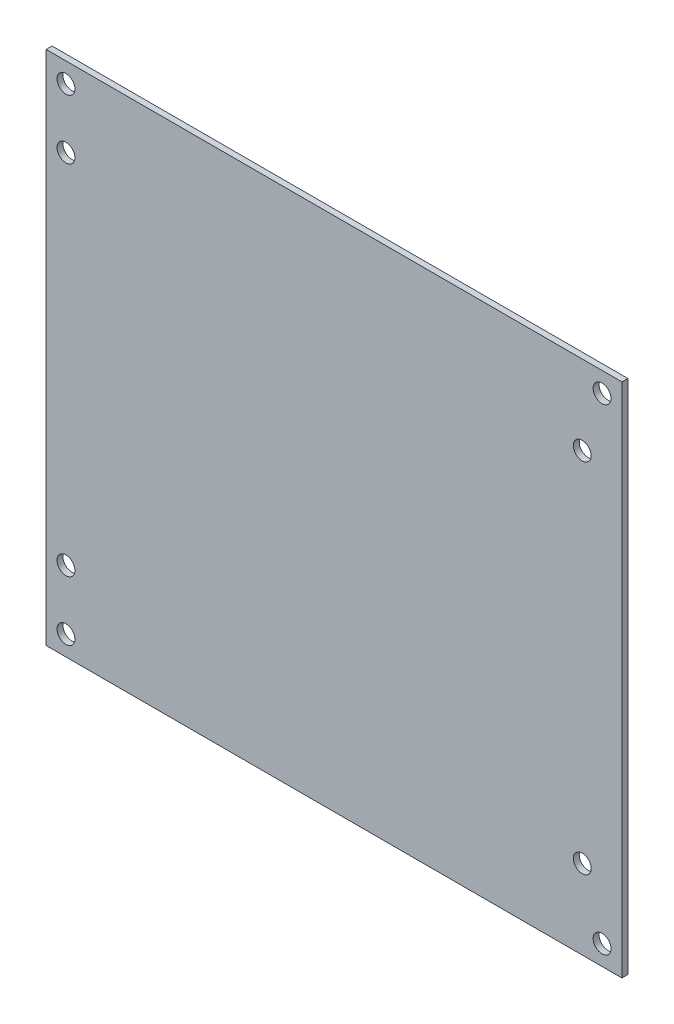
ISO-10303-21;
HEADER;
FILE_DESCRIPTION(('STEP AP214'),'2;1');
FILE_NAME('part.step','',(''),(''),'','','');
FILE_SCHEMA(('AUTOMOTIVE_DESIGN { 1 0 10303 214 1 1 1 1 }'));
ENDSEC;
DATA;
#1=APPLICATION_CONTEXT('core data for automotive mechanical design processes');
#2=APPLICATION_PROTOCOL_DEFINITION('international standard','automotive_design',2000,#1);
#3=PRODUCT_CONTEXT('',#1,'mechanical');
#4=PRODUCT('Part','Part','',(#3));
#5=PRODUCT_RELATED_PRODUCT_CATEGORY('part','',(#4));
#6=PRODUCT_DEFINITION_FORMATION('','',#4);
#7=PRODUCT_DEFINITION_CONTEXT('part definition',#1,'design');
#8=PRODUCT_DEFINITION('design','',#6,#7);
#9=PRODUCT_DEFINITION_SHAPE('','',#8);
#10=(LENGTH_UNIT() NAMED_UNIT(*) SI_UNIT(.MILLI.,.METRE.));
#11=(NAMED_UNIT(*) PLANE_ANGLE_UNIT() SI_UNIT($,.RADIAN.));
#12=(NAMED_UNIT(*) SI_UNIT($,.STERADIAN.) SOLID_ANGLE_UNIT());
#13=UNCERTAINTY_MEASURE_WITH_UNIT(LENGTH_MEASURE(1.E-05),#10,'distance_accuracy_value','');
#14=(GEOMETRIC_REPRESENTATION_CONTEXT(3) GLOBAL_UNCERTAINTY_ASSIGNED_CONTEXT((#13)) GLOBAL_UNIT_ASSIGNED_CONTEXT((#10,
#11,#12)) REPRESENTATION_CONTEXT('',''));
#15=CARTESIAN_POINT('',(0.,0.,0.));
#16=DIRECTION('',(0.,0.,1.));
#17=DIRECTION('',(1.,0.,0.));
#18=AXIS2_PLACEMENT_3D('',#15,#16,#17);
#19=CARTESIAN_POINT('',(-72.5,-65.,1.5));
#20=DIRECTION('',(0.,0.,-1.));
#21=DIRECTION('',(-1.,0.,0.));
#22=AXIS2_PLACEMENT_3D('',#19,#20,#21);
#23=PLANE('',#22);
#24=CARTESIAN_POINT('',(62.5,45.,1.5));
#25=DIRECTION('',(0.,0.,1.));
#26=DIRECTION('',(1.,0.,0.));
#27=AXIS2_PLACEMENT_3D('',#24,#25,#26);
#28=CIRCLE('',#27,2.25);
#29=CARTESIAN_POINT('',(64.75,45.,1.5));
#30=VERTEX_POINT('',#29);
#31=EDGE_CURVE('E143',#30,#30,#28,.T.);
#32=ORIENTED_EDGE('',*,*,#31,.F.);
#33=EDGE_LOOP('',(#32));
#34=FACE_BOUND('',#33,.T.);
#35=CARTESIAN_POINT('',(-67.5,45.,1.5));
#36=DIRECTION('',(0.,0.,1.));
#37=DIRECTION('',(1.,0.,0.));
#38=AXIS2_PLACEMENT_3D('',#35,#36,#37);
#39=CIRCLE('',#38,2.25);
#40=CARTESIAN_POINT('',(-65.25,45.,1.5));
#41=VERTEX_POINT('',#40);
#42=EDGE_CURVE('E131',#41,#41,#39,.T.);
#43=ORIENTED_EDGE('',*,*,#42,.F.);
#44=EDGE_LOOP('',(#43));
#45=FACE_BOUND('',#44,.T.);
#46=CARTESIAN_POINT('',(67.5,-60.,1.5));
#47=DIRECTION('',(0.,0.,1.));
#48=DIRECTION('',(1.,0.,0.));
#49=AXIS2_PLACEMENT_3D('',#46,#47,#48);
#50=CIRCLE('',#49,2.25);
#51=CARTESIAN_POINT('',(69.75,-60.,1.5));
#52=VERTEX_POINT('',#51);
#53=EDGE_CURVE('E119',#52,#52,#50,.T.);
#54=ORIENTED_EDGE('',*,*,#53,.F.);
#55=EDGE_LOOP('',(#54));
#56=FACE_BOUND('',#55,.T.);
#57=CARTESIAN_POINT('',(-67.5,60.,1.5));
#58=DIRECTION('',(0.,0.,1.));
#59=DIRECTION('',(1.,0.,0.));
#60=AXIS2_PLACEMENT_3D('',#57,#58,#59);
#61=CIRCLE('',#60,2.25);
#62=CARTESIAN_POINT('',(-65.25,60.,1.5));
#63=VERTEX_POINT('',#62);
#64=EDGE_CURVE('E98',#63,#63,#61,.T.);
#65=ORIENTED_EDGE('',*,*,#64,.F.);
#66=EDGE_LOOP('',(#65));
#67=FACE_BOUND('',#66,.T.);
#68=DIRECTION('',(0.,-1.,0.));
#69=VECTOR('',#68,1.);
#70=CARTESIAN_POINT('',(-72.5,-65.,1.5));
#71=LINE('',#70,#69);
#72=CARTESIAN_POINT('',(-72.5,65.,1.5));
#73=VERTEX_POINT('',#72);
#74=CARTESIAN_POINT('',(-72.5,-65.,1.5));
#75=VERTEX_POINT('',#74);
#76=EDGE_CURVE('E83',#73,#75,#71,.T.);
#77=ORIENTED_EDGE('',*,*,#76,.T.);
#78=DIRECTION('',(1.,0.,0.));
#79=VECTOR('',#78,1.);
#80=CARTESIAN_POINT('',(-72.5,-65.,1.5));
#81=LINE('',#80,#79);
#82=CARTESIAN_POINT('',(72.5,-65.,1.5));
#83=VERTEX_POINT('',#82);
#84=EDGE_CURVE('E78',#75,#83,#81,.T.);
#85=ORIENTED_EDGE('',*,*,#84,.T.);
#86=DIRECTION('',(0.,1.,0.));
#87=VECTOR('',#86,1.);
#88=CARTESIAN_POINT('',(72.5,-65.,1.5));
#89=LINE('',#88,#87);
#90=CARTESIAN_POINT('',(72.5,65.,1.5));
#91=VERTEX_POINT('',#90);
#92=EDGE_CURVE('E81',#83,#91,#89,.T.);
#93=ORIENTED_EDGE('',*,*,#92,.T.);
#94=DIRECTION('',(-1.,0.,0.));
#95=VECTOR('',#94,1.);
#96=CARTESIAN_POINT('',(-72.5,65.,1.5));
#97=LINE('',#96,#95);
#98=EDGE_CURVE('E48',#91,#73,#97,.T.);
#99=ORIENTED_EDGE('',*,*,#98,.T.);
#100=EDGE_LOOP('',(#77,#85,#93,#99));
#101=FACE_BOUND('',#100,.T.);
#102=CARTESIAN_POINT('',(-67.5,-60.,1.5));
#103=DIRECTION('',(0.,0.,1.));
#104=DIRECTION('',(-1.,0.,0.));
#105=AXIS2_PLACEMENT_3D('',#102,#103,#104);
#106=CIRCLE('',#105,2.25);
#107=CARTESIAN_POINT('',(-69.75,-60.,1.5));
#108=VERTEX_POINT('',#107);
#109=EDGE_CURVE('E113',#108,#108,#106,.T.);
#110=ORIENTED_EDGE('',*,*,#109,.F.);
#111=EDGE_LOOP('',(#110));
#112=FACE_BOUND('',#111,.T.);
#113=CARTESIAN_POINT('',(67.5,60.,1.5));
#114=DIRECTION('',(0.,0.,1.));
#115=DIRECTION('',(-1.,0.,0.));
#116=AXIS2_PLACEMENT_3D('',#113,#114,#115);
#117=CIRCLE('',#116,2.25);
#118=CARTESIAN_POINT('',(65.25,60.,1.5));
#119=VERTEX_POINT('',#118);
#120=EDGE_CURVE('E125',#119,#119,#117,.T.);
#121=ORIENTED_EDGE('',*,*,#120,.F.);
#122=EDGE_LOOP('',(#121));
#123=FACE_BOUND('',#122,.T.);
#124=CARTESIAN_POINT('',(-67.5,-45.,1.5));
#125=DIRECTION('',(0.,0.,1.));
#126=DIRECTION('',(-1.,0.,0.));
#127=AXIS2_PLACEMENT_3D('',#124,#125,#126);
#128=CIRCLE('',#127,2.25);
#129=CARTESIAN_POINT('',(-69.75,-45.,1.5));
#130=VERTEX_POINT('',#129);
#131=EDGE_CURVE('E137',#130,#130,#128,.T.);
#132=ORIENTED_EDGE('',*,*,#131,.F.);
#133=EDGE_LOOP('',(#132));
#134=FACE_BOUND('',#133,.T.);
#135=CARTESIAN_POINT('',(62.5,-45.,1.5));
#136=DIRECTION('',(0.,0.,1.));
#137=DIRECTION('',(-1.,0.,0.));
#138=AXIS2_PLACEMENT_3D('',#135,#136,#137);
#139=CIRCLE('',#138,2.25);
#140=CARTESIAN_POINT('',(60.25,-45.,1.5));
#141=VERTEX_POINT('',#140);
#142=EDGE_CURVE('E149',#141,#141,#139,.T.);
#143=ORIENTED_EDGE('',*,*,#142,.F.);
#144=EDGE_LOOP('',(#143));
#145=FACE_BOUND('',#144,.T.);
#146=ADVANCED_FACE('F31',(#34,#45,#56,#67,#101,#112,#123,#134,#145),#23,.F.);
#147=CARTESIAN_POINT('',(-72.5,-65.,0.));
#148=DIRECTION('',(0.,0.,-1.));
#149=DIRECTION('',(-1.,0.,0.));
#150=AXIS2_PLACEMENT_3D('',#147,#148,#149);
#151=PLANE('',#150);
#152=CARTESIAN_POINT('',(62.5,45.,0.));
#153=DIRECTION('',(0.,0.,1.));
#154=DIRECTION('',(1.,0.,0.));
#155=AXIS2_PLACEMENT_3D('',#152,#153,#154);
#156=CIRCLE('',#155,2.25);
#157=CARTESIAN_POINT('',(64.75,45.,0.));
#158=VERTEX_POINT('',#157);
#159=EDGE_CURVE('E146',#158,#158,#156,.T.);
#160=ORIENTED_EDGE('',*,*,#159,.T.);
#161=EDGE_LOOP('',(#160));
#162=FACE_BOUND('',#161,.T.);
#163=CARTESIAN_POINT('',(-67.5,45.,0.));
#164=DIRECTION('',(0.,0.,1.));
#165=DIRECTION('',(1.,0.,0.));
#166=AXIS2_PLACEMENT_3D('',#163,#164,#165);
#167=CIRCLE('',#166,2.25);
#168=CARTESIAN_POINT('',(-65.25,45.,0.));
#169=VERTEX_POINT('',#168);
#170=EDGE_CURVE('E134',#169,#169,#167,.T.);
#171=ORIENTED_EDGE('',*,*,#170,.T.);
#172=EDGE_LOOP('',(#171));
#173=FACE_BOUND('',#172,.T.);
#174=CARTESIAN_POINT('',(67.5,-60.,0.));
#175=DIRECTION('',(0.,0.,1.));
#176=DIRECTION('',(1.,0.,0.));
#177=AXIS2_PLACEMENT_3D('',#174,#175,#176);
#178=CIRCLE('',#177,2.25);
#179=CARTESIAN_POINT('',(69.75,-60.,0.));
#180=VERTEX_POINT('',#179);
#181=EDGE_CURVE('E122',#180,#180,#178,.T.);
#182=ORIENTED_EDGE('',*,*,#181,.T.);
#183=EDGE_LOOP('',(#182));
#184=FACE_BOUND('',#183,.T.);
#185=CARTESIAN_POINT('',(-67.5,60.,0.));
#186=DIRECTION('',(0.,0.,1.));
#187=DIRECTION('',(1.,0.,0.));
#188=AXIS2_PLACEMENT_3D('',#185,#186,#187);
#189=CIRCLE('',#188,2.25);
#190=CARTESIAN_POINT('',(-65.25,60.,0.));
#191=VERTEX_POINT('',#190);
#192=EDGE_CURVE('E110',#191,#191,#189,.T.);
#193=ORIENTED_EDGE('',*,*,#192,.T.);
#194=EDGE_LOOP('',(#193));
#195=FACE_BOUND('',#194,.T.);
#196=DIRECTION('',(0.,-1.,0.));
#197=VECTOR('',#196,1.);
#198=CARTESIAN_POINT('',(-72.5,-65.,0.));
#199=LINE('',#198,#197);
#200=CARTESIAN_POINT('',(-72.5,65.,0.));
#201=VERTEX_POINT('',#200);
#202=CARTESIAN_POINT('',(-72.5,-65.,0.));
#203=VERTEX_POINT('',#202);
#204=EDGE_CURVE('E95',#201,#203,#199,.T.);
#205=ORIENTED_EDGE('',*,*,#204,.F.);
#206=DIRECTION('',(-1.,0.,0.));
#207=VECTOR('',#206,1.);
#208=CARTESIAN_POINT('',(-72.5,65.,0.));
#209=LINE('',#208,#207);
#210=CARTESIAN_POINT('',(72.5,65.,0.));
#211=VERTEX_POINT('',#210);
#212=EDGE_CURVE('E71',#211,#201,#209,.T.);
#213=ORIENTED_EDGE('',*,*,#212,.F.);
#214=DIRECTION('',(0.,1.,0.));
#215=VECTOR('',#214,1.);
#216=CARTESIAN_POINT('',(72.5,-65.,0.));
#217=LINE('',#216,#215);
#218=CARTESIAN_POINT('',(72.5,-65.,0.));
#219=VERTEX_POINT('',#218);
#220=EDGE_CURVE('E65',#219,#211,#217,.T.);
#221=ORIENTED_EDGE('',*,*,#220,.F.);
#222=DIRECTION('',(1.,0.,0.));
#223=VECTOR('',#222,1.);
#224=CARTESIAN_POINT('',(-72.5,-65.,0.));
#225=LINE('',#224,#223);
#226=EDGE_CURVE('E87',#203,#219,#225,.T.);
#227=ORIENTED_EDGE('',*,*,#226,.F.);
#228=EDGE_LOOP('',(#205,#213,#221,#227));
#229=FACE_BOUND('',#228,.T.);
#230=CARTESIAN_POINT('',(-67.5,-60.,0.));
#231=DIRECTION('',(0.,0.,1.));
#232=DIRECTION('',(-1.,0.,0.));
#233=AXIS2_PLACEMENT_3D('',#230,#231,#232);
#234=CIRCLE('',#233,2.25);
#235=CARTESIAN_POINT('',(-69.75,-60.,0.));
#236=VERTEX_POINT('',#235);
#237=EDGE_CURVE('E116',#236,#236,#234,.T.);
#238=ORIENTED_EDGE('',*,*,#237,.T.);
#239=EDGE_LOOP('',(#238));
#240=FACE_BOUND('',#239,.T.);
#241=CARTESIAN_POINT('',(67.5,60.,0.));
#242=DIRECTION('',(0.,0.,1.));
#243=DIRECTION('',(-1.,0.,0.));
#244=AXIS2_PLACEMENT_3D('',#241,#242,#243);
#245=CIRCLE('',#244,2.25);
#246=CARTESIAN_POINT('',(65.25,60.,0.));
#247=VERTEX_POINT('',#246);
#248=EDGE_CURVE('E128',#247,#247,#245,.T.);
#249=ORIENTED_EDGE('',*,*,#248,.T.);
#250=EDGE_LOOP('',(#249));
#251=FACE_BOUND('',#250,.T.);
#252=CARTESIAN_POINT('',(-67.5,-45.,0.));
#253=DIRECTION('',(0.,0.,1.));
#254=DIRECTION('',(-1.,0.,0.));
#255=AXIS2_PLACEMENT_3D('',#252,#253,#254);
#256=CIRCLE('',#255,2.25);
#257=CARTESIAN_POINT('',(-69.75,-45.,0.));
#258=VERTEX_POINT('',#257);
#259=EDGE_CURVE('E140',#258,#258,#256,.T.);
#260=ORIENTED_EDGE('',*,*,#259,.T.);
#261=EDGE_LOOP('',(#260));
#262=FACE_BOUND('',#261,.T.);
#263=CARTESIAN_POINT('',(62.5,-45.,0.));
#264=DIRECTION('',(0.,0.,1.));
#265=DIRECTION('',(-1.,0.,0.));
#266=AXIS2_PLACEMENT_3D('',#263,#264,#265);
#267=CIRCLE('',#266,2.25);
#268=CARTESIAN_POINT('',(60.25,-45.,0.));
#269=VERTEX_POINT('',#268);
#270=EDGE_CURVE('E152',#269,#269,#267,.T.);
#271=ORIENTED_EDGE('',*,*,#270,.T.);
#272=EDGE_LOOP('',(#271));
#273=FACE_BOUND('',#272,.T.);
#274=ADVANCED_FACE('F106',(#162,#173,#184,#195,#229,#240,#251,#262,#273),#151,.T.);
#275=CARTESIAN_POINT('',(-72.5,-65.,1.5));
#276=DIRECTION('',(1.,0.,0.));
#277=DIRECTION('',(0.,1.,0.));
#278=AXIS2_PLACEMENT_3D('',#275,#276,#277);
#279=PLANE('',#278);
#280=ORIENTED_EDGE('',*,*,#204,.T.);
#281=DIRECTION('',(0.,0.,-1.));
#282=VECTOR('',#281,1.);
#283=CARTESIAN_POINT('',(-72.5,-65.,1.5));
#284=LINE('',#283,#282);
#285=EDGE_CURVE('E11',#75,#203,#284,.T.);
#286=ORIENTED_EDGE('',*,*,#285,.F.);
#287=ORIENTED_EDGE('',*,*,#76,.F.);
#288=DIRECTION('',(0.,0.,-1.));
#289=VECTOR('',#288,1.);
#290=CARTESIAN_POINT('',(-72.5,65.,1.5));
#291=LINE('',#290,#289);
#292=EDGE_CURVE('E91',#73,#201,#291,.T.);
#293=ORIENTED_EDGE('',*,*,#292,.T.);
#294=EDGE_LOOP('',(#280,#286,#287,#293));
#295=FACE_BOUND('',#294,.T.);
#296=ADVANCED_FACE('F33',(#295),#279,.F.);
#297=CARTESIAN_POINT('',(-72.5,-65.,1.5));
#298=DIRECTION('',(0.,1.,0.));
#299=DIRECTION('',(-1.,0.,0.));
#300=AXIS2_PLACEMENT_3D('',#297,#298,#299);
#301=PLANE('',#300);
#302=ORIENTED_EDGE('',*,*,#226,.T.);
#303=DIRECTION('',(0.,0.,-1.));
#304=VECTOR('',#303,1.);
#305=CARTESIAN_POINT('',(72.5,-65.,1.5));
#306=LINE('',#305,#304);
#307=EDGE_CURVE('E40',#83,#219,#306,.T.);
#308=ORIENTED_EDGE('',*,*,#307,.F.);
#309=ORIENTED_EDGE('',*,*,#84,.F.);
#310=ORIENTED_EDGE('',*,*,#285,.T.);
#311=EDGE_LOOP('',(#302,#308,#309,#310));
#312=FACE_BOUND('',#311,.T.);
#313=ADVANCED_FACE('F86',(#312),#301,.F.);
#314=CARTESIAN_POINT('',(72.5,-65.,1.5));
#315=DIRECTION('',(-1.,0.,0.));
#316=DIRECTION('',(0.,-1.,0.));
#317=AXIS2_PLACEMENT_3D('',#314,#315,#316);
#318=PLANE('',#317);
#319=ORIENTED_EDGE('',*,*,#220,.T.);
#320=DIRECTION('',(0.,0.,-1.));
#321=VECTOR('',#320,1.);
#322=CARTESIAN_POINT('',(72.5,65.,1.5));
#323=LINE('',#322,#321);
#324=EDGE_CURVE('E88',#91,#211,#323,.T.);
#325=ORIENTED_EDGE('',*,*,#324,.F.);
#326=ORIENTED_EDGE('',*,*,#92,.F.);
#327=ORIENTED_EDGE('',*,*,#307,.T.);
#328=EDGE_LOOP('',(#319,#325,#326,#327));
#329=FACE_BOUND('',#328,.T.);
#330=ADVANCED_FACE('F89',(#329),#318,.F.);
#331=CARTESIAN_POINT('',(-72.5,65.,1.5));
#332=DIRECTION('',(0.,-1.,0.));
#333=DIRECTION('',(0.,0.,-1.));
#334=AXIS2_PLACEMENT_3D('',#331,#332,#333);
#335=PLANE('',#334);
#336=ORIENTED_EDGE('',*,*,#212,.T.);
#337=ORIENTED_EDGE('',*,*,#292,.F.);
#338=ORIENTED_EDGE('',*,*,#98,.F.);
#339=ORIENTED_EDGE('',*,*,#324,.T.);
#340=EDGE_LOOP('',(#336,#337,#338,#339));
#341=FACE_BOUND('',#340,.T.);
#342=ADVANCED_FACE('F103',(#341),#335,.F.);
#343=CARTESIAN_POINT('',(-67.5,60.,1.5));
#344=DIRECTION('',(0.,0.,-1.));
#345=DIRECTION('',(-1.,0.,0.));
#346=AXIS2_PLACEMENT_3D('',#343,#344,#345);
#347=CYLINDRICAL_SURFACE('',#346,2.25);
#348=ORIENTED_EDGE('',*,*,#64,.T.);
#349=EDGE_LOOP('',(#348));
#350=FACE_BOUND('',#349,.T.);
#351=ORIENTED_EDGE('',*,*,#192,.F.);
#352=EDGE_LOOP('',(#351));
#353=FACE_BOUND('',#352,.T.);
#354=ADVANCED_FACE('F172',(#350,#353),#347,.F.);
#355=CARTESIAN_POINT('',(-67.5,-60.,1.5));
#356=DIRECTION('',(0.,0.,-1.));
#357=DIRECTION('',(-1.,0.,0.));
#358=AXIS2_PLACEMENT_3D('',#355,#356,#357);
#359=CYLINDRICAL_SURFACE('',#358,2.25);
#360=ORIENTED_EDGE('',*,*,#109,.T.);
#361=EDGE_LOOP('',(#360));
#362=FACE_BOUND('',#361,.T.);
#363=ORIENTED_EDGE('',*,*,#237,.F.);
#364=EDGE_LOOP('',(#363));
#365=FACE_BOUND('',#364,.T.);
#366=ADVANCED_FACE('F218',(#362,#365),#359,.F.);
#367=CARTESIAN_POINT('',(67.5,-60.,1.5));
#368=DIRECTION('',(0.,0.,-1.));
#369=DIRECTION('',(-1.,0.,0.));
#370=AXIS2_PLACEMENT_3D('',#367,#368,#369);
#371=CYLINDRICAL_SURFACE('',#370,2.25);
#372=ORIENTED_EDGE('',*,*,#53,.T.);
#373=EDGE_LOOP('',(#372));
#374=FACE_BOUND('',#373,.T.);
#375=ORIENTED_EDGE('',*,*,#181,.F.);
#376=EDGE_LOOP('',(#375));
#377=FACE_BOUND('',#376,.T.);
#378=ADVANCED_FACE('F226',(#374,#377),#371,.F.);
#379=CARTESIAN_POINT('',(67.5,60.,1.5));
#380=DIRECTION('',(0.,0.,-1.));
#381=DIRECTION('',(-1.,0.,0.));
#382=AXIS2_PLACEMENT_3D('',#379,#380,#381);
#383=CYLINDRICAL_SURFACE('',#382,2.25);
#384=ORIENTED_EDGE('',*,*,#120,.T.);
#385=EDGE_LOOP('',(#384));
#386=FACE_BOUND('',#385,.T.);
#387=ORIENTED_EDGE('',*,*,#248,.F.);
#388=EDGE_LOOP('',(#387));
#389=FACE_BOUND('',#388,.T.);
#390=ADVANCED_FACE('F234',(#386,#389),#383,.F.);
#391=CARTESIAN_POINT('',(-67.5,45.,1.5));
#392=DIRECTION('',(0.,0.,-1.));
#393=DIRECTION('',(-1.,0.,0.));
#394=AXIS2_PLACEMENT_3D('',#391,#392,#393);
#395=CYLINDRICAL_SURFACE('',#394,2.25);
#396=ORIENTED_EDGE('',*,*,#42,.T.);
#397=EDGE_LOOP('',(#396));
#398=FACE_BOUND('',#397,.T.);
#399=ORIENTED_EDGE('',*,*,#170,.F.);
#400=EDGE_LOOP('',(#399));
#401=FACE_BOUND('',#400,.T.);
#402=ADVANCED_FACE('F243',(#398,#401),#395,.F.);
#403=CARTESIAN_POINT('',(-67.5,-45.,1.5));
#404=DIRECTION('',(0.,0.,-1.));
#405=DIRECTION('',(-1.,0.,0.));
#406=AXIS2_PLACEMENT_3D('',#403,#404,#405);
#407=CYLINDRICAL_SURFACE('',#406,2.25);
#408=ORIENTED_EDGE('',*,*,#131,.T.);
#409=EDGE_LOOP('',(#408));
#410=FACE_BOUND('',#409,.T.);
#411=ORIENTED_EDGE('',*,*,#259,.F.);
#412=EDGE_LOOP('',(#411));
#413=FACE_BOUND('',#412,.T.);
#414=ADVANCED_FACE('F252',(#410,#413),#407,.F.);
#415=CARTESIAN_POINT('',(62.5,45.,1.5));
#416=DIRECTION('',(0.,0.,-1.));
#417=DIRECTION('',(-1.,0.,0.));
#418=AXIS2_PLACEMENT_3D('',#415,#416,#417);
#419=CYLINDRICAL_SURFACE('',#418,2.25);
#420=ORIENTED_EDGE('',*,*,#31,.T.);
#421=EDGE_LOOP('',(#420));
#422=FACE_BOUND('',#421,.T.);
#423=ORIENTED_EDGE('',*,*,#159,.F.);
#424=EDGE_LOOP('',(#423));
#425=FACE_BOUND('',#424,.T.);
#426=ADVANCED_FACE('F261',(#422,#425),#419,.F.);
#427=CARTESIAN_POINT('',(62.5,-45.,1.5));
#428=DIRECTION('',(0.,0.,-1.));
#429=DIRECTION('',(-1.,0.,0.));
#430=AXIS2_PLACEMENT_3D('',#427,#428,#429);
#431=CYLINDRICAL_SURFACE('',#430,2.25);
#432=ORIENTED_EDGE('',*,*,#142,.T.);
#433=EDGE_LOOP('',(#432));
#434=FACE_BOUND('',#433,.T.);
#435=ORIENTED_EDGE('',*,*,#270,.F.);
#436=EDGE_LOOP('',(#435));
#437=FACE_BOUND('',#436,.T.);
#438=ADVANCED_FACE('F158',(#434,#437),#431,.F.);
#439=CLOSED_SHELL('',(#146,#274,#296,#313,#330,#342,#354,#366,#378,#390,#402,#414,#426,#438));
#440=MANIFOLD_SOLID_BREP('B2',#439);
#441=ADVANCED_BREP_SHAPE_REPRESENTATION('',(#18,#440),#14);
#442=SHAPE_DEFINITION_REPRESENTATION(#9,#441);
ENDSEC;
END-ISO-10303-21;
